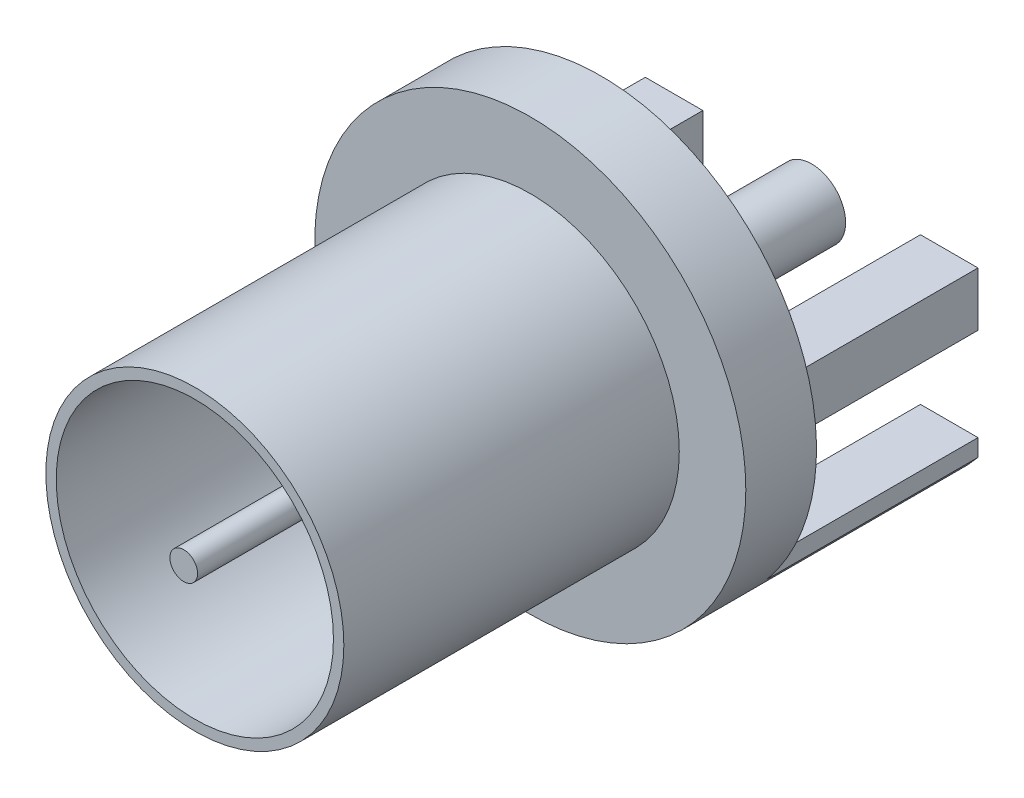
ISO-10303-21;
HEADER;
FILE_DESCRIPTION(('STEP AP214'),'2;1');
FILE_NAME('part.step','',(''),(''),'','','');
FILE_SCHEMA(('AUTOMOTIVE_DESIGN { 1 0 10303 214 1 1 1 1 }'));
ENDSEC;
DATA;
#1=APPLICATION_CONTEXT('core data for automotive mechanical design processes');
#2=APPLICATION_PROTOCOL_DEFINITION('international standard','automotive_design',2000,#1);
#3=PRODUCT_CONTEXT('',#1,'mechanical');
#4=PRODUCT('Part','Part','',(#3));
#5=PRODUCT_RELATED_PRODUCT_CATEGORY('part','',(#4));
#6=PRODUCT_DEFINITION_FORMATION('','',#4);
#7=PRODUCT_DEFINITION_CONTEXT('part definition',#1,'design');
#8=PRODUCT_DEFINITION('design','',#6,#7);
#9=PRODUCT_DEFINITION_SHAPE('','',#8);
#10=(LENGTH_UNIT() NAMED_UNIT(*) SI_UNIT(.MILLI.,.METRE.));
#11=(NAMED_UNIT(*) PLANE_ANGLE_UNIT() SI_UNIT($,.RADIAN.));
#12=(NAMED_UNIT(*) SI_UNIT($,.STERADIAN.) SOLID_ANGLE_UNIT());
#13=UNCERTAINTY_MEASURE_WITH_UNIT(LENGTH_MEASURE(1.E-05),#10,'distance_accuracy_value','');
#14=(GEOMETRIC_REPRESENTATION_CONTEXT(3) GLOBAL_UNCERTAINTY_ASSIGNED_CONTEXT((#13)) GLOBAL_UNIT_ASSIGNED_CONTEXT((#10,
#11,#12)) REPRESENTATION_CONTEXT('',''));
#15=CARTESIAN_POINT('',(0.,0.,0.));
#16=DIRECTION('',(0.,0.,1.));
#17=DIRECTION('',(1.,0.,0.));
#18=AXIS2_PLACEMENT_3D('',#15,#16,#17);
#19=CARTESIAN_POINT('',(0.,0.,1.2954));
#20=DIRECTION('',(0.,0.,1.));
#21=DIRECTION('',(1.,0.,0.));
#22=AXIS2_PLACEMENT_3D('',#19,#20,#21);
#23=PLANE('',#22);
#24=CARTESIAN_POINT('',(0.,0.,1.2954));
#25=DIRECTION('',(0.,0.,1.));
#26=DIRECTION('',(1.,0.,0.));
#27=AXIS2_PLACEMENT_3D('',#24,#25,#26);
#28=CIRCLE('',#27,2.54);
#29=CARTESIAN_POINT('',(2.54,0.,1.2954));
#30=VERTEX_POINT('',#29);
#31=EDGE_CURVE('E43',#30,#30,#28,.F.);
#32=ORIENTED_EDGE('',*,*,#31,.F.);
#33=EDGE_LOOP('',(#32));
#34=FACE_BOUND('',#33,.T.);
#35=CARTESIAN_POINT('',(0.,0.,1.2954));
#36=DIRECTION('',(0.,0.,1.));
#37=DIRECTION('',(1.,0.,0.));
#38=AXIS2_PLACEMENT_3D('',#35,#36,#37);
#39=CIRCLE('',#38,0.254);
#40=CARTESIAN_POINT('',(0.254,0.,1.2954));
#41=VERTEX_POINT('',#40);
#42=EDGE_CURVE('E290',#41,#41,#39,.T.);
#43=ORIENTED_EDGE('',*,*,#42,.F.);
#44=EDGE_LOOP('',(#43));
#45=FACE_BOUND('',#44,.T.);
#46=ADVANCED_FACE('F35',(#34,#45),#23,.T.);
#47=CARTESIAN_POINT('',(0.,0.,0.));
#48=DIRECTION('',(0.,0.,1.));
#49=DIRECTION('',(1.,0.,0.));
#50=AXIS2_PLACEMENT_3D('',#47,#48,#49);
#51=PLANE('',#50);
#52=DIRECTION('',(0.,-1.,0.));
#53=VECTOR('',#52,1.);
#54=CARTESIAN_POINT('',(-1.9939,-2.1971,0.));
#55=LINE('',#54,#53);
#56=CARTESIAN_POINT('',(-1.9939,-2.1971,0.));
#57=VERTEX_POINT('',#56);
#58=CARTESIAN_POINT('',(-1.9939,-3.40947105575044,0.));
#59=VERTEX_POINT('',#58);
#60=EDGE_CURVE('E50',#57,#59,#55,.T.);
#61=ORIENTED_EDGE('',*,*,#60,.F.);
#62=DIRECTION('',(1.,0.,0.));
#63=VECTOR('',#62,1.);
#64=CARTESIAN_POINT('',(-1.9939,-2.1971,0.));
#65=LINE('',#64,#63);
#66=CARTESIAN_POINT('',(-3.048,-2.1971,0.));
#67=VERTEX_POINT('',#66);
#68=EDGE_CURVE('E165',#67,#57,#65,.T.);
#69=ORIENTED_EDGE('',*,*,#68,.F.);
#70=DIRECTION('',(0.,1.,0.));
#71=VECTOR('',#70,1.);
#72=CARTESIAN_POINT('',(-3.048,-2.1971,0.));
#73=LINE('',#72,#71);
#74=CARTESIAN_POINT('',(-3.048,-2.51193672093865,0.));
#75=VERTEX_POINT('',#74);
#76=EDGE_CURVE('E304',#75,#67,#73,.T.);
#77=ORIENTED_EDGE('',*,*,#76,.F.);
#78=CARTESIAN_POINT('',(0.,0.,0.));
#79=DIRECTION('',(0.,0.,1.));
#80=DIRECTION('',(1.,0.,0.));
#81=AXIS2_PLACEMENT_3D('',#78,#79,#80);
#82=CIRCLE('',#81,3.9497);
#83=CARTESIAN_POINT('',(3.048,-2.51193672093865,0.));
#84=VERTEX_POINT('',#83);
#85=EDGE_CURVE('E277',#84,#75,#82,.T.);
#86=ORIENTED_EDGE('',*,*,#85,.F.);
#87=DIRECTION('',(0.,-1.,0.));
#88=VECTOR('',#87,1.);
#89=CARTESIAN_POINT('',(3.048,-2.1971,0.));
#90=LINE('',#89,#88);
#91=CARTESIAN_POINT('',(3.048,-2.1971,0.));
#92=VERTEX_POINT('',#91);
#93=EDGE_CURVE('E180',#92,#84,#90,.T.);
#94=ORIENTED_EDGE('',*,*,#93,.F.);
#95=DIRECTION('',(1.,0.,0.));
#96=VECTOR('',#95,1.);
#97=CARTESIAN_POINT('',(1.9939,-2.1971,0.));
#98=LINE('',#97,#96);
#99=CARTESIAN_POINT('',(1.9939,-2.1971,0.));
#100=VERTEX_POINT('',#99);
#101=EDGE_CURVE('E170',#100,#92,#98,.T.);
#102=ORIENTED_EDGE('',*,*,#101,.F.);
#103=DIRECTION('',(0.,1.,0.));
#104=VECTOR('',#103,1.);
#105=CARTESIAN_POINT('',(1.9939,-3.40947105575044,0.));
#106=LINE('',#105,#104);
#107=CARTESIAN_POINT('',(1.9939,-3.40947105575044,0.));
#108=VERTEX_POINT('',#107);
#109=EDGE_CURVE('E168',#108,#100,#106,.T.);
#110=ORIENTED_EDGE('',*,*,#109,.F.);
#111=EDGE_CURVE('E271',#59,#108,#82,.T.);
#112=ORIENTED_EDGE('',*,*,#111,.F.);
#113=EDGE_LOOP('',(#61,#69,#77,#86,#94,#102,#110,#112));
#114=FACE_BOUND('',#113,.T.);
#115=DIRECTION('',(0.,-1.,0.));
#116=VECTOR('',#115,1.);
#117=CARTESIAN_POINT('',(-1.9939,0.472898063786876,0.));
#118=LINE('',#117,#116);
#119=CARTESIAN_POINT('',(-1.9939,0.472898063786876,0.));
#120=VERTEX_POINT('',#119);
#121=CARTESIAN_POINT('',(-1.9939,-0.4953,0.));
#122=VERTEX_POINT('',#121);
#123=EDGE_CURVE('E198',#120,#122,#118,.T.);
#124=ORIENTED_EDGE('',*,*,#123,.F.);
#125=DIRECTION('',(1.,0.,0.));
#126=VECTOR('',#125,1.);
#127=CARTESIAN_POINT('',(-1.9939,0.472898063786876,0.));
#128=LINE('',#127,#126);
#129=CARTESIAN_POINT('',(-3.048,0.472898063786876,0.));
#130=VERTEX_POINT('',#129);
#131=EDGE_CURVE('E203',#130,#120,#128,.T.);
#132=ORIENTED_EDGE('',*,*,#131,.F.);
#133=DIRECTION('',(0.,1.,0.));
#134=VECTOR('',#133,1.);
#135=CARTESIAN_POINT('',(-3.048,0.472898063786876,0.));
#136=LINE('',#135,#134);
#137=CARTESIAN_POINT('',(-3.048,-0.4953,0.));
#138=VERTEX_POINT('',#137);
#139=EDGE_CURVE('E215',#138,#130,#136,.T.);
#140=ORIENTED_EDGE('',*,*,#139,.F.);
#141=DIRECTION('',(-1.,0.,0.));
#142=VECTOR('',#141,1.);
#143=CARTESIAN_POINT('',(-1.9939,-0.4953,0.));
#144=LINE('',#143,#142);
#145=EDGE_CURVE('E212',#122,#138,#144,.T.);
#146=ORIENTED_EDGE('',*,*,#145,.F.);
#147=EDGE_LOOP('',(#124,#132,#140,#146));
#148=FACE_BOUND('',#147,.T.);
#149=DIRECTION('',(0.,-1.,0.));
#150=VECTOR('',#149,1.);
#151=CARTESIAN_POINT('',(3.048,0.4953,0.));
#152=LINE('',#151,#150);
#153=CARTESIAN_POINT('',(3.048,0.4953,0.));
#154=VERTEX_POINT('',#153);
#155=CARTESIAN_POINT('',(3.048,-0.4953,0.));
#156=VERTEX_POINT('',#155);
#157=EDGE_CURVE('E231',#154,#156,#152,.T.);
#158=ORIENTED_EDGE('',*,*,#157,.F.);
#159=DIRECTION('',(1.,0.,0.));
#160=VECTOR('',#159,1.);
#161=CARTESIAN_POINT('',(3.048,0.4953,0.));
#162=LINE('',#161,#160);
#163=CARTESIAN_POINT('',(1.9939,0.4953,0.));
#164=VERTEX_POINT('',#163);
#165=EDGE_CURVE('E236',#164,#154,#162,.T.);
#166=ORIENTED_EDGE('',*,*,#165,.F.);
#167=DIRECTION('',(0.,1.,0.));
#168=VECTOR('',#167,1.);
#169=CARTESIAN_POINT('',(1.9939,0.4953,0.));
#170=LINE('',#169,#168);
#171=CARTESIAN_POINT('',(1.9939,-0.4953,0.));
#172=VERTEX_POINT('',#171);
#173=EDGE_CURVE('E248',#172,#164,#170,.T.);
#174=ORIENTED_EDGE('',*,*,#173,.F.);
#175=DIRECTION('',(-1.,0.,0.));
#176=VECTOR('',#175,1.);
#177=CARTESIAN_POINT('',(3.048,-0.4953,0.));
#178=LINE('',#177,#176);
#179=EDGE_CURVE('E245',#156,#172,#178,.T.);
#180=ORIENTED_EDGE('',*,*,#179,.F.);
#181=EDGE_LOOP('',(#158,#166,#174,#180));
#182=FACE_BOUND('',#181,.T.);
#183=CARTESIAN_POINT('',(0.,0.,0.));
#184=DIRECTION('',(0.,0.,1.));
#185=DIRECTION('',(1.,0.,0.));
#186=AXIS2_PLACEMENT_3D('',#183,#184,#185);
#187=CIRCLE('',#186,0.6223);
#188=CARTESIAN_POINT('',(0.6223,0.,0.));
#189=VERTEX_POINT('',#188);
#190=EDGE_CURVE('E11',#189,#189,#187,.F.);
#191=ORIENTED_EDGE('',*,*,#190,.F.);
#192=EDGE_LOOP('',(#191));
#193=FACE_BOUND('',#192,.T.);
#194=ADVANCED_FACE('F285',(#114,#148,#182,#193),#51,.F.);
#195=CARTESIAN_POINT('',(0.,0.,1.2954));
#196=DIRECTION('',(0.,0.,1.));
#197=DIRECTION('',(1.,0.,0.));
#198=AXIS2_PLACEMENT_3D('',#195,#196,#197);
#199=CIRCLE('',#198,3.9497);
#200=CARTESIAN_POINT('',(3.9497,0.,1.2954));
#201=VERTEX_POINT('',#200);
#202=EDGE_CURVE('E274',#201,#201,#199,.T.);
#203=ORIENTED_EDGE('',*,*,#202,.T.);
#204=EDGE_LOOP('',(#203));
#205=FACE_BOUND('',#204,.T.);
#206=CARTESIAN_POINT('',(0.,0.,1.2954));
#207=DIRECTION('',(0.,0.,1.));
#208=DIRECTION('',(1.,0.,0.));
#209=AXIS2_PLACEMENT_3D('',#206,#207,#208);
#210=CIRCLE('',#209,2.7305);
#211=CARTESIAN_POINT('',(2.7305,0.,1.2954));
#212=VERTEX_POINT('',#211);
#213=EDGE_CURVE('E267',#212,#212,#210,.T.);
#214=ORIENTED_EDGE('',*,*,#213,.F.);
#215=EDGE_LOOP('',(#214));
#216=FACE_BOUND('',#215,.T.);
#217=ADVANCED_FACE('F287',(#205,#216),#23,.T.);
#218=CARTESIAN_POINT('',(0.,0.,1.2954));
#219=DIRECTION('',(0.,0.,-1.));
#220=DIRECTION('',(-1.,0.,0.));
#221=AXIS2_PLACEMENT_3D('',#218,#219,#220);
#222=CYLINDRICAL_SURFACE('',#221,3.9497);
#223=ORIENTED_EDGE('',*,*,#202,.F.);
#224=EDGE_LOOP('',(#223));
#225=FACE_BOUND('',#224,.T.);
#226=ORIENTED_EDGE('',*,*,#85,.T.);
#227=DIRECTION('',(0.,0.,1.));
#228=VECTOR('',#227,1.);
#229=CARTESIAN_POINT('',(-3.048,-2.51193672093865,-3.8608));
#230=LINE('',#229,#228);
#231=CARTESIAN_POINT('',(-3.048,-2.51193672093865,-3.8608));
#232=VERTEX_POINT('',#231);
#233=EDGE_CURVE('E154',#232,#75,#230,.T.);
#234=ORIENTED_EDGE('',*,*,#233,.F.);
#235=CARTESIAN_POINT('',(0.,0.,-3.8608));
#236=DIRECTION('',(0.,0.,-1.));
#237=DIRECTION('',(-1.,0.,0.));
#238=AXIS2_PLACEMENT_3D('',#235,#236,#237);
#239=CIRCLE('',#238,3.9497);
#240=CARTESIAN_POINT('',(-1.9939,-3.40947105575044,-3.8608));
#241=VERTEX_POINT('',#240);
#242=EDGE_CURVE('E150',#241,#232,#239,.T.);
#243=ORIENTED_EDGE('',*,*,#242,.F.);
#244=DIRECTION('',(0.,0.,1.));
#245=VECTOR('',#244,1.);
#246=CARTESIAN_POINT('',(-1.9939,-3.40947105575044,-3.8608));
#247=LINE('',#246,#245);
#248=EDGE_CURVE('E152',#241,#59,#247,.T.);
#249=ORIENTED_EDGE('',*,*,#248,.T.);
#250=ORIENTED_EDGE('',*,*,#111,.T.);
#251=DIRECTION('',(0.,0.,1.));
#252=VECTOR('',#251,1.);
#253=CARTESIAN_POINT('',(1.9939,-3.40947105575044,-3.8608));
#254=LINE('',#253,#252);
#255=CARTESIAN_POINT('',(1.9939,-3.40947105575044,-3.8608));
#256=VERTEX_POINT('',#255);
#257=EDGE_CURVE('E195',#256,#108,#254,.T.);
#258=ORIENTED_EDGE('',*,*,#257,.F.);
#259=CARTESIAN_POINT('',(0.,0.,-3.8608));
#260=DIRECTION('',(0.,0.,-1.));
#261=DIRECTION('',(-1.,0.,0.));
#262=AXIS2_PLACEMENT_3D('',#259,#260,#261);
#263=CIRCLE('',#262,3.9497);
#264=CARTESIAN_POINT('',(3.048,-2.51193672093865,-3.8608));
#265=VERTEX_POINT('',#264);
#266=EDGE_CURVE('E176',#265,#256,#263,.T.);
#267=ORIENTED_EDGE('',*,*,#266,.F.);
#268=DIRECTION('',(0.,0.,1.));
#269=VECTOR('',#268,1.);
#270=CARTESIAN_POINT('',(3.048,-2.51193672093865,-3.8608));
#271=LINE('',#270,#269);
#272=EDGE_CURVE('E58',#265,#84,#271,.T.);
#273=ORIENTED_EDGE('',*,*,#272,.T.);
#274=EDGE_LOOP('',(#226,#234,#243,#249,#250,#258,#267,#273));
#275=FACE_BOUND('',#274,.T.);
#276=ADVANCED_FACE('F37',(#225,#275),#222,.T.);
#277=CARTESIAN_POINT('',(0.,0.,7.4422));
#278=DIRECTION('',(0.,0.,1.));
#279=DIRECTION('',(1.,0.,0.));
#280=AXIS2_PLACEMENT_3D('',#277,#278,#279);
#281=PLANE('',#280);
#282=CARTESIAN_POINT('',(0.,0.,7.4422));
#283=DIRECTION('',(0.,0.,1.));
#284=DIRECTION('',(1.,0.,0.));
#285=AXIS2_PLACEMENT_3D('',#282,#283,#284);
#286=CIRCLE('',#285,2.7305);
#287=CARTESIAN_POINT('',(2.7305,0.,7.4422));
#288=VERTEX_POINT('',#287);
#289=EDGE_CURVE('E268',#288,#288,#286,.T.);
#290=ORIENTED_EDGE('',*,*,#289,.T.);
#291=EDGE_LOOP('',(#290));
#292=FACE_BOUND('',#291,.T.);
#293=CARTESIAN_POINT('',(0.,0.,7.4422));
#294=DIRECTION('',(0.,0.,1.));
#295=DIRECTION('',(1.,0.,0.));
#296=AXIS2_PLACEMENT_3D('',#293,#294,#295);
#297=CIRCLE('',#296,2.54);
#298=CARTESIAN_POINT('',(2.54,0.,7.4422));
#299=VERTEX_POINT('',#298);
#300=EDGE_CURVE('E264',#299,#299,#297,.T.);
#301=ORIENTED_EDGE('',*,*,#300,.F.);
#302=EDGE_LOOP('',(#301));
#303=FACE_BOUND('',#302,.T.);
#304=ADVANCED_FACE('F387',(#292,#303),#281,.T.);
#305=CARTESIAN_POINT('',(0.,0.,7.4422));
#306=DIRECTION('',(0.,0.,-1.));
#307=DIRECTION('',(-1.,0.,0.));
#308=AXIS2_PLACEMENT_3D('',#305,#306,#307);
#309=CYLINDRICAL_SURFACE('',#308,2.7305);
#310=ORIENTED_EDGE('',*,*,#289,.F.);
#311=EDGE_LOOP('',(#310));
#312=FACE_BOUND('',#311,.T.);
#313=ORIENTED_EDGE('',*,*,#213,.T.);
#314=EDGE_LOOP('',(#313));
#315=FACE_BOUND('',#314,.T.);
#316=ADVANCED_FACE('F385',(#312,#315),#309,.T.);
#317=CARTESIAN_POINT('',(0.,0.,7.4422));
#318=DIRECTION('',(0.,0.,-1.));
#319=DIRECTION('',(-1.,0.,0.));
#320=AXIS2_PLACEMENT_3D('',#317,#318,#319);
#321=CYLINDRICAL_SURFACE('',#320,2.54);
#322=ORIENTED_EDGE('',*,*,#300,.T.);
#323=EDGE_LOOP('',(#322));
#324=FACE_BOUND('',#323,.T.);
#325=ORIENTED_EDGE('',*,*,#31,.T.);
#326=EDGE_LOOP('',(#325));
#327=FACE_BOUND('',#326,.T.);
#328=ADVANCED_FACE('F281',(#324,#327),#321,.F.);
#329=CARTESIAN_POINT('',(3.048,0.4953,-3.8608));
#330=DIRECTION('',(-1.,0.,0.));
#331=DIRECTION('',(0.,0.,1.));
#332=AXIS2_PLACEMENT_3D('',#329,#330,#331);
#333=PLANE('',#332);
#334=ORIENTED_EDGE('',*,*,#157,.T.);
#335=DIRECTION('',(0.,0.,1.));
#336=VECTOR('',#335,1.);
#337=CARTESIAN_POINT('',(3.048,-0.4953,-3.8608));
#338=LINE('',#337,#336);
#339=CARTESIAN_POINT('',(3.048,-0.4953,-3.8608));
#340=VERTEX_POINT('',#339);
#341=EDGE_CURVE('E261',#340,#156,#338,.T.);
#342=ORIENTED_EDGE('',*,*,#341,.F.);
#343=DIRECTION('',(0.,-1.,0.));
#344=VECTOR('',#343,1.);
#345=CARTESIAN_POINT('',(3.048,0.4953,-3.8608));
#346=LINE('',#345,#344);
#347=CARTESIAN_POINT('',(3.048,0.4953,-3.8608));
#348=VERTEX_POINT('',#347);
#349=EDGE_CURVE('E232',#348,#340,#346,.T.);
#350=ORIENTED_EDGE('',*,*,#349,.F.);
#351=DIRECTION('',(0.,0.,1.));
#352=VECTOR('',#351,1.);
#353=CARTESIAN_POINT('',(3.048,0.4953,-3.8608));
#354=LINE('',#353,#352);
#355=EDGE_CURVE('E242',#348,#154,#354,.T.);
#356=ORIENTED_EDGE('',*,*,#355,.T.);
#357=EDGE_LOOP('',(#334,#342,#350,#356));
#358=FACE_BOUND('',#357,.T.);
#359=ADVANCED_FACE('F378',(#358),#333,.F.);
#360=CARTESIAN_POINT('',(3.048,-0.4953,-3.8608));
#361=DIRECTION('',(0.,1.,0.));
#362=DIRECTION('',(0.,0.,1.));
#363=AXIS2_PLACEMENT_3D('',#360,#361,#362);
#364=PLANE('',#363);
#365=ORIENTED_EDGE('',*,*,#179,.T.);
#366=DIRECTION('',(0.,0.,1.));
#367=VECTOR('',#366,1.);
#368=CARTESIAN_POINT('',(1.9939,-0.4953,-3.8608));
#369=LINE('',#368,#367);
#370=CARTESIAN_POINT('',(1.9939,-0.4953,-3.8608));
#371=VERTEX_POINT('',#370);
#372=EDGE_CURVE('E258',#371,#172,#369,.T.);
#373=ORIENTED_EDGE('',*,*,#372,.F.);
#374=DIRECTION('',(-1.,0.,0.));
#375=VECTOR('',#374,1.);
#376=CARTESIAN_POINT('',(3.048,-0.4953,-3.8608));
#377=LINE('',#376,#375);
#378=EDGE_CURVE('E235',#340,#371,#377,.T.);
#379=ORIENTED_EDGE('',*,*,#378,.F.);
#380=ORIENTED_EDGE('',*,*,#341,.T.);
#381=EDGE_LOOP('',(#365,#373,#379,#380));
#382=FACE_BOUND('',#381,.T.);
#383=ADVANCED_FACE('F374',(#382),#364,.F.);
#384=CARTESIAN_POINT('',(1.9939,0.4953,-3.8608));
#385=DIRECTION('',(1.,0.,0.));
#386=DIRECTION('',(0.,0.,-1.));
#387=AXIS2_PLACEMENT_3D('',#384,#385,#386);
#388=PLANE('',#387);
#389=ORIENTED_EDGE('',*,*,#173,.T.);
#390=DIRECTION('',(0.,0.,1.));
#391=VECTOR('',#390,1.);
#392=CARTESIAN_POINT('',(1.9939,0.4953,-3.8608));
#393=LINE('',#392,#391);
#394=CARTESIAN_POINT('',(1.9939,0.4953,-3.8608));
#395=VERTEX_POINT('',#394);
#396=EDGE_CURVE('E255',#395,#164,#393,.T.);
#397=ORIENTED_EDGE('',*,*,#396,.F.);
#398=DIRECTION('',(0.,1.,0.));
#399=VECTOR('',#398,1.);
#400=CARTESIAN_POINT('',(1.9939,0.4953,-3.8608));
#401=LINE('',#400,#399);
#402=EDGE_CURVE('E238',#371,#395,#401,.T.);
#403=ORIENTED_EDGE('',*,*,#402,.F.);
#404=ORIENTED_EDGE('',*,*,#372,.T.);
#405=EDGE_LOOP('',(#389,#397,#403,#404));
#406=FACE_BOUND('',#405,.T.);
#407=ADVANCED_FACE('F370',(#406),#388,.F.);
#408=CARTESIAN_POINT('',(3.048,0.4953,-3.8608));
#409=DIRECTION('',(0.,-1.,0.));
#410=DIRECTION('',(0.,0.,-1.));
#411=AXIS2_PLACEMENT_3D('',#408,#409,#410);
#412=PLANE('',#411);
#413=ORIENTED_EDGE('',*,*,#165,.T.);
#414=ORIENTED_EDGE('',*,*,#355,.F.);
#415=DIRECTION('',(1.,0.,0.));
#416=VECTOR('',#415,1.);
#417=CARTESIAN_POINT('',(3.048,0.4953,-3.8608));
#418=LINE('',#417,#416);
#419=EDGE_CURVE('E240',#395,#348,#418,.T.);
#420=ORIENTED_EDGE('',*,*,#419,.F.);
#421=ORIENTED_EDGE('',*,*,#396,.T.);
#422=EDGE_LOOP('',(#413,#414,#420,#421));
#423=FACE_BOUND('',#422,.T.);
#424=ADVANCED_FACE('F366',(#423),#412,.F.);
#425=CARTESIAN_POINT('',(0.,0.,-3.8608));
#426=DIRECTION('',(0.,0.,-1.));
#427=DIRECTION('',(-1.,0.,0.));
#428=AXIS2_PLACEMENT_3D('',#425,#426,#427);
#429=PLANE('',#428);
#430=ORIENTED_EDGE('',*,*,#349,.T.);
#431=ORIENTED_EDGE('',*,*,#378,.T.);
#432=ORIENTED_EDGE('',*,*,#402,.T.);
#433=ORIENTED_EDGE('',*,*,#419,.T.);
#434=EDGE_LOOP('',(#430,#431,#432,#433));
#435=FACE_BOUND('',#434,.T.);
#436=ADVANCED_FACE('F362',(#435),#429,.T.);
#437=CARTESIAN_POINT('',(-1.9939,0.472898063786876,-3.8608));
#438=DIRECTION('',(-1.,0.,0.));
#439=DIRECTION('',(0.,0.,1.));
#440=AXIS2_PLACEMENT_3D('',#437,#438,#439);
#441=PLANE('',#440);
#442=ORIENTED_EDGE('',*,*,#123,.T.);
#443=DIRECTION('',(0.,0.,1.));
#444=VECTOR('',#443,1.);
#445=CARTESIAN_POINT('',(-1.9939,-0.4953,-3.8608));
#446=LINE('',#445,#444);
#447=CARTESIAN_POINT('',(-1.9939,-0.4953,-3.8608));
#448=VERTEX_POINT('',#447);
#449=EDGE_CURVE('E228',#448,#122,#446,.T.);
#450=ORIENTED_EDGE('',*,*,#449,.F.);
#451=DIRECTION('',(0.,-1.,0.));
#452=VECTOR('',#451,1.);
#453=CARTESIAN_POINT('',(-1.9939,0.472898063786876,-3.8608));
#454=LINE('',#453,#452);
#455=CARTESIAN_POINT('',(-1.9939,0.472898063786876,-3.8608));
#456=VERTEX_POINT('',#455);
#457=EDGE_CURVE('E199',#456,#448,#454,.T.);
#458=ORIENTED_EDGE('',*,*,#457,.F.);
#459=DIRECTION('',(0.,0.,1.));
#460=VECTOR('',#459,1.);
#461=CARTESIAN_POINT('',(-1.9939,0.472898063786876,-3.8608));
#462=LINE('',#461,#460);
#463=EDGE_CURVE('E209',#456,#120,#462,.T.);
#464=ORIENTED_EDGE('',*,*,#463,.T.);
#465=EDGE_LOOP('',(#442,#450,#458,#464));
#466=FACE_BOUND('',#465,.T.);
#467=ADVANCED_FACE('F358',(#466),#441,.F.);
#468=CARTESIAN_POINT('',(-1.9939,-0.4953,-3.8608));
#469=DIRECTION('',(0.,1.,0.));
#470=DIRECTION('',(0.,0.,1.));
#471=AXIS2_PLACEMENT_3D('',#468,#469,#470);
#472=PLANE('',#471);
#473=ORIENTED_EDGE('',*,*,#145,.T.);
#474=DIRECTION('',(0.,0.,1.));
#475=VECTOR('',#474,1.);
#476=CARTESIAN_POINT('',(-3.048,-0.4953,-3.8608));
#477=LINE('',#476,#475);
#478=CARTESIAN_POINT('',(-3.048,-0.4953,-3.8608));
#479=VERTEX_POINT('',#478);
#480=EDGE_CURVE('E225',#479,#138,#477,.T.);
#481=ORIENTED_EDGE('',*,*,#480,.F.);
#482=DIRECTION('',(-1.,0.,0.));
#483=VECTOR('',#482,1.);
#484=CARTESIAN_POINT('',(-1.9939,-0.4953,-3.8608));
#485=LINE('',#484,#483);
#486=EDGE_CURVE('E202',#448,#479,#485,.T.);
#487=ORIENTED_EDGE('',*,*,#486,.F.);
#488=ORIENTED_EDGE('',*,*,#449,.T.);
#489=EDGE_LOOP('',(#473,#481,#487,#488));
#490=FACE_BOUND('',#489,.T.);
#491=ADVANCED_FACE('F354',(#490),#472,.F.);
#492=CARTESIAN_POINT('',(-3.048,0.472898063786876,-3.8608));
#493=DIRECTION('',(1.,0.,0.));
#494=DIRECTION('',(0.,0.,-1.));
#495=AXIS2_PLACEMENT_3D('',#492,#493,#494);
#496=PLANE('',#495);
#497=ORIENTED_EDGE('',*,*,#139,.T.);
#498=DIRECTION('',(0.,0.,1.));
#499=VECTOR('',#498,1.);
#500=CARTESIAN_POINT('',(-3.048,0.472898063786876,-3.8608));
#501=LINE('',#500,#499);
#502=CARTESIAN_POINT('',(-3.048,0.472898063786876,-3.8608));
#503=VERTEX_POINT('',#502);
#504=EDGE_CURVE('E222',#503,#130,#501,.T.);
#505=ORIENTED_EDGE('',*,*,#504,.F.);
#506=DIRECTION('',(0.,1.,0.));
#507=VECTOR('',#506,1.);
#508=CARTESIAN_POINT('',(-3.048,0.472898063786876,-3.8608));
#509=LINE('',#508,#507);
#510=EDGE_CURVE('E205',#479,#503,#509,.T.);
#511=ORIENTED_EDGE('',*,*,#510,.F.);
#512=ORIENTED_EDGE('',*,*,#480,.T.);
#513=EDGE_LOOP('',(#497,#505,#511,#512));
#514=FACE_BOUND('',#513,.T.);
#515=ADVANCED_FACE('F350',(#514),#496,.F.);
#516=CARTESIAN_POINT('',(-1.9939,0.472898063786876,-3.8608));
#517=DIRECTION('',(0.,-1.,0.));
#518=DIRECTION('',(0.,0.,-1.));
#519=AXIS2_PLACEMENT_3D('',#516,#517,#518);
#520=PLANE('',#519);
#521=ORIENTED_EDGE('',*,*,#131,.T.);
#522=ORIENTED_EDGE('',*,*,#463,.F.);
#523=DIRECTION('',(1.,0.,0.));
#524=VECTOR('',#523,1.);
#525=CARTESIAN_POINT('',(-1.9939,0.472898063786876,-3.8608));
#526=LINE('',#525,#524);
#527=EDGE_CURVE('E207',#503,#456,#526,.T.);
#528=ORIENTED_EDGE('',*,*,#527,.F.);
#529=ORIENTED_EDGE('',*,*,#504,.T.);
#530=EDGE_LOOP('',(#521,#522,#528,#529));
#531=FACE_BOUND('',#530,.T.);
#532=ADVANCED_FACE('F346',(#531),#520,.F.);
#533=CARTESIAN_POINT('',(0.,0.,-3.8608));
#534=DIRECTION('',(0.,0.,-1.));
#535=DIRECTION('',(-1.,0.,0.));
#536=AXIS2_PLACEMENT_3D('',#533,#534,#535);
#537=PLANE('',#536);
#538=ORIENTED_EDGE('',*,*,#457,.T.);
#539=ORIENTED_EDGE('',*,*,#486,.T.);
#540=ORIENTED_EDGE('',*,*,#510,.T.);
#541=ORIENTED_EDGE('',*,*,#527,.T.);
#542=EDGE_LOOP('',(#538,#539,#540,#541));
#543=FACE_BOUND('',#542,.T.);
#544=ADVANCED_FACE('F340',(#543),#537,.T.);
#545=CARTESIAN_POINT('',(1.9939,-3.40947105575044,-3.8608));
#546=DIRECTION('',(1.,0.,0.));
#547=DIRECTION('',(0.,1.,0.));
#548=AXIS2_PLACEMENT_3D('',#545,#546,#547);
#549=PLANE('',#548);
#550=ORIENTED_EDGE('',*,*,#109,.T.);
#551=DIRECTION('',(0.,0.,1.));
#552=VECTOR('',#551,1.);
#553=CARTESIAN_POINT('',(1.9939,-2.1971,-3.8608));
#554=LINE('',#553,#552);
#555=CARTESIAN_POINT('',(1.9939,-2.1971,-3.8608));
#556=VERTEX_POINT('',#555);
#557=EDGE_CURVE('E192',#556,#100,#554,.T.);
#558=ORIENTED_EDGE('',*,*,#557,.F.);
#559=DIRECTION('',(0.,1.,0.));
#560=VECTOR('',#559,1.);
#561=CARTESIAN_POINT('',(1.9939,-3.40947105575044,-3.8608));
#562=LINE('',#561,#560);
#563=EDGE_CURVE('E179',#256,#556,#562,.T.);
#564=ORIENTED_EDGE('',*,*,#563,.F.);
#565=ORIENTED_EDGE('',*,*,#257,.T.);
#566=EDGE_LOOP('',(#550,#558,#564,#565));
#567=FACE_BOUND('',#566,.T.);
#568=ADVANCED_FACE('F321',(#567),#549,.F.);
#569=CARTESIAN_POINT('',(1.9939,-2.1971,-3.8608));
#570=DIRECTION('',(0.,-1.,0.));
#571=DIRECTION('',(0.,0.,-1.));
#572=AXIS2_PLACEMENT_3D('',#569,#570,#571);
#573=PLANE('',#572);
#574=ORIENTED_EDGE('',*,*,#101,.T.);
#575=DIRECTION('',(0.,0.,1.));
#576=VECTOR('',#575,1.);
#577=CARTESIAN_POINT('',(3.048,-2.1971,-3.8608));
#578=LINE('',#577,#576);
#579=CARTESIAN_POINT('',(3.048,-2.1971,-3.8608));
#580=VERTEX_POINT('',#579);
#581=EDGE_CURVE('E189',#580,#92,#578,.T.);
#582=ORIENTED_EDGE('',*,*,#581,.F.);
#583=DIRECTION('',(1.,0.,0.));
#584=VECTOR('',#583,1.);
#585=CARTESIAN_POINT('',(1.9939,-2.1971,-3.8608));
#586=LINE('',#585,#584);
#587=EDGE_CURVE('E182',#556,#580,#586,.T.);
#588=ORIENTED_EDGE('',*,*,#587,.F.);
#589=ORIENTED_EDGE('',*,*,#557,.T.);
#590=EDGE_LOOP('',(#574,#582,#588,#589));
#591=FACE_BOUND('',#590,.T.);
#592=ADVANCED_FACE('F332',(#591),#573,.F.);
#593=CARTESIAN_POINT('',(3.048,-2.1971,-3.8608));
#594=DIRECTION('',(-1.,0.,0.));
#595=DIRECTION('',(0.,0.,1.));
#596=AXIS2_PLACEMENT_3D('',#593,#594,#595);
#597=PLANE('',#596);
#598=ORIENTED_EDGE('',*,*,#93,.T.);
#599=ORIENTED_EDGE('',*,*,#272,.F.);
#600=DIRECTION('',(0.,-1.,0.));
#601=VECTOR('',#600,1.);
#602=CARTESIAN_POINT('',(3.048,-2.1971,-3.8608));
#603=LINE('',#602,#601);
#604=EDGE_CURVE('E184',#580,#265,#603,.T.);
#605=ORIENTED_EDGE('',*,*,#604,.F.);
#606=ORIENTED_EDGE('',*,*,#581,.T.);
#607=EDGE_LOOP('',(#598,#599,#605,#606));
#608=FACE_BOUND('',#607,.T.);
#609=ADVANCED_FACE('F329',(#608),#597,.F.);
#610=CARTESIAN_POINT('',(0.,0.,-3.8608));
#611=DIRECTION('',(0.,0.,-1.));
#612=DIRECTION('',(-1.,0.,0.));
#613=AXIS2_PLACEMENT_3D('',#610,#611,#612);
#614=PLANE('',#613);
#615=ORIENTED_EDGE('',*,*,#266,.T.);
#616=ORIENTED_EDGE('',*,*,#563,.T.);
#617=ORIENTED_EDGE('',*,*,#587,.T.);
#618=ORIENTED_EDGE('',*,*,#604,.T.);
#619=EDGE_LOOP('',(#615,#616,#617,#618));
#620=FACE_BOUND('',#619,.T.);
#621=ADVANCED_FACE('F325',(#620),#614,.T.);
#622=CARTESIAN_POINT('',(-1.9939,-2.1971,-3.8608));
#623=DIRECTION('',(-1.,0.,0.));
#624=DIRECTION('',(0.,0.,1.));
#625=AXIS2_PLACEMENT_3D('',#622,#623,#624);
#626=PLANE('',#625);
#627=ORIENTED_EDGE('',*,*,#60,.T.);
#628=ORIENTED_EDGE('',*,*,#248,.F.);
#629=DIRECTION('',(0.,-1.,0.));
#630=VECTOR('',#629,1.);
#631=CARTESIAN_POINT('',(-1.9939,-2.1971,-3.8608));
#632=LINE('',#631,#630);
#633=CARTESIAN_POINT('',(-1.9939,-2.1971,-3.8608));
#634=VERTEX_POINT('',#633);
#635=EDGE_CURVE('E158',#634,#241,#632,.T.);
#636=ORIENTED_EDGE('',*,*,#635,.F.);
#637=DIRECTION('',(0.,0.,1.));
#638=VECTOR('',#637,1.);
#639=CARTESIAN_POINT('',(-1.9939,-2.1971,-3.8608));
#640=LINE('',#639,#638);
#641=EDGE_CURVE('E302',#634,#57,#640,.T.);
#642=ORIENTED_EDGE('',*,*,#641,.T.);
#643=EDGE_LOOP('',(#627,#628,#636,#642));
#644=FACE_BOUND('',#643,.T.);
#645=ADVANCED_FACE('F167',(#644),#626,.F.);
#646=CARTESIAN_POINT('',(-3.048,-2.1971,-3.8608));
#647=DIRECTION('',(1.,0.,0.));
#648=DIRECTION('',(0.,0.,-1.));
#649=AXIS2_PLACEMENT_3D('',#646,#647,#648);
#650=PLANE('',#649);
#651=ORIENTED_EDGE('',*,*,#76,.T.);
#652=DIRECTION('',(0.,0.,1.));
#653=VECTOR('',#652,1.);
#654=CARTESIAN_POINT('',(-3.048,-2.1971,-3.8608));
#655=LINE('',#654,#653);
#656=CARTESIAN_POINT('',(-3.048,-2.1971,-3.8608));
#657=VERTEX_POINT('',#656);
#658=EDGE_CURVE('E172',#657,#67,#655,.T.);
#659=ORIENTED_EDGE('',*,*,#658,.F.);
#660=DIRECTION('',(0.,1.,0.));
#661=VECTOR('',#660,1.);
#662=CARTESIAN_POINT('',(-3.048,-2.1971,-3.8608));
#663=LINE('',#662,#661);
#664=EDGE_CURVE('E157',#232,#657,#663,.T.);
#665=ORIENTED_EDGE('',*,*,#664,.F.);
#666=ORIENTED_EDGE('',*,*,#233,.T.);
#667=EDGE_LOOP('',(#651,#659,#665,#666));
#668=FACE_BOUND('',#667,.T.);
#669=ADVANCED_FACE('F490',(#668),#650,.F.);
#670=CARTESIAN_POINT('',(-1.9939,-2.1971,-3.8608));
#671=DIRECTION('',(0.,-1.,0.));
#672=DIRECTION('',(0.,0.,-1.));
#673=AXIS2_PLACEMENT_3D('',#670,#671,#672);
#674=PLANE('',#673);
#675=ORIENTED_EDGE('',*,*,#68,.T.);
#676=ORIENTED_EDGE('',*,*,#641,.F.);
#677=DIRECTION('',(1.,0.,0.));
#678=VECTOR('',#677,1.);
#679=CARTESIAN_POINT('',(-1.9939,-2.1971,-3.8608));
#680=LINE('',#679,#678);
#681=EDGE_CURVE('E163',#657,#634,#680,.T.);
#682=ORIENTED_EDGE('',*,*,#681,.F.);
#683=ORIENTED_EDGE('',*,*,#658,.T.);
#684=EDGE_LOOP('',(#675,#676,#682,#683));
#685=FACE_BOUND('',#684,.T.);
#686=ADVANCED_FACE('F311',(#685),#674,.F.);
#687=CARTESIAN_POINT('',(0.,0.,-3.8608));
#688=DIRECTION('',(0.,0.,-1.));
#689=DIRECTION('',(-1.,0.,0.));
#690=AXIS2_PLACEMENT_3D('',#687,#688,#689);
#691=PLANE('',#690);
#692=ORIENTED_EDGE('',*,*,#635,.T.);
#693=ORIENTED_EDGE('',*,*,#242,.T.);
#694=ORIENTED_EDGE('',*,*,#664,.T.);
#695=ORIENTED_EDGE('',*,*,#681,.T.);
#696=EDGE_LOOP('',(#692,#693,#694,#695));
#697=FACE_BOUND('',#696,.T.);
#698=ADVANCED_FACE('F161',(#697),#691,.T.);
#699=CARTESIAN_POINT('',(0.,0.,-3.8608));
#700=DIRECTION('',(0.,0.,1.));
#701=DIRECTION('',(1.,0.,0.));
#702=AXIS2_PLACEMENT_3D('',#699,#700,#701);
#703=CYLINDRICAL_SURFACE('',#702,0.6223);
#704=CARTESIAN_POINT('',(0.,0.,-3.8608));
#705=DIRECTION('',(0.,0.,-1.));
#706=DIRECTION('',(-1.,0.,0.));
#707=AXIS2_PLACEMENT_3D('',#704,#705,#706);
#708=CIRCLE('',#707,0.6223);
#709=CARTESIAN_POINT('',(-0.6223,0.,-3.8608));
#710=VERTEX_POINT('',#709);
#711=EDGE_CURVE('E295',#710,#710,#708,.T.);
#712=ORIENTED_EDGE('',*,*,#711,.F.);
#713=EDGE_LOOP('',(#712));
#714=FACE_BOUND('',#713,.T.);
#715=ORIENTED_EDGE('',*,*,#190,.T.);
#716=EDGE_LOOP('',(#715));
#717=FACE_BOUND('',#716,.T.);
#718=ADVANCED_FACE('F514',(#714,#717),#703,.T.);
#719=CARTESIAN_POINT('',(0.,0.,-3.8608));
#720=DIRECTION('',(0.,0.,-1.));
#721=DIRECTION('',(-1.,0.,0.));
#722=AXIS2_PLACEMENT_3D('',#719,#720,#721);
#723=PLANE('',#722);
#724=ORIENTED_EDGE('',*,*,#711,.T.);
#725=EDGE_LOOP('',(#724));
#726=FACE_BOUND('',#725,.T.);
#727=ADVANCED_FACE('F528',(#726),#723,.T.);
#728=CARTESIAN_POINT('',(0.,0.,7.6454));
#729=DIRECTION('',(0.,0.,-1.));
#730=DIRECTION('',(-1.,0.,0.));
#731=AXIS2_PLACEMENT_3D('',#728,#729,#730);
#732=CYLINDRICAL_SURFACE('',#731,0.254);
#733=CARTESIAN_POINT('',(0.,0.,7.6454));
#734=DIRECTION('',(0.,0.,1.));
#735=DIRECTION('',(1.,0.,0.));
#736=AXIS2_PLACEMENT_3D('',#733,#734,#735);
#737=CIRCLE('',#736,0.254);
#738=CARTESIAN_POINT('',(0.254,0.,7.6454));
#739=VERTEX_POINT('',#738);
#740=EDGE_CURVE('E292',#739,#739,#737,.T.);
#741=ORIENTED_EDGE('',*,*,#740,.F.);
#742=EDGE_LOOP('',(#741));
#743=FACE_BOUND('',#742,.T.);
#744=ORIENTED_EDGE('',*,*,#42,.T.);
#745=EDGE_LOOP('',(#744));
#746=FACE_BOUND('',#745,.T.);
#747=ADVANCED_FACE('F538',(#743,#746),#732,.T.);
#748=CARTESIAN_POINT('',(0.,0.,7.6454));
#749=DIRECTION('',(0.,0.,1.));
#750=DIRECTION('',(1.,0.,0.));
#751=AXIS2_PLACEMENT_3D('',#748,#749,#750);
#752=PLANE('',#751);
#753=ORIENTED_EDGE('',*,*,#740,.T.);
#754=EDGE_LOOP('',(#753));
#755=FACE_BOUND('',#754,.T.);
#756=ADVANCED_FACE('F554',(#755),#752,.T.);
#757=CLOSED_SHELL('',(#46,#194,#217,#276,#304,#316,#328,#359,#383,#407,#424,#436,#467,#491,#515,
#532,#544,#568,#592,#609,#621,#645,#669,#686,#698,#718,#727,#747,#756));
#758=MANIFOLD_SOLID_BREP('B2',#757);
#759=ADVANCED_BREP_SHAPE_REPRESENTATION('',(#18,#758),#14);
#760=SHAPE_DEFINITION_REPRESENTATION(#9,#759);
ENDSEC;
END-ISO-10303-21;
